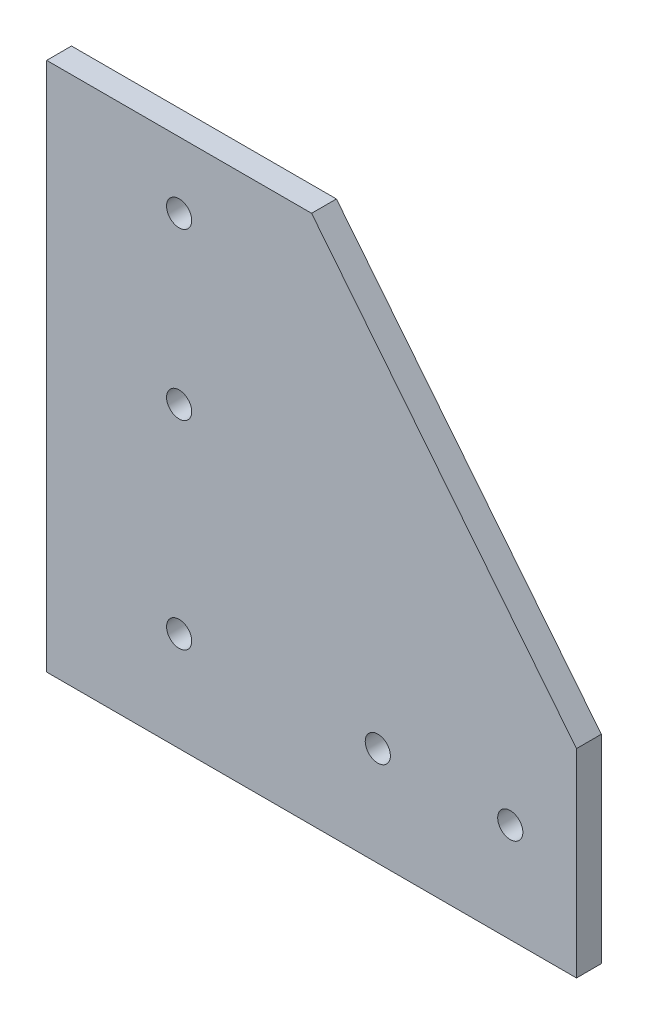
ISO-10303-21;
HEADER;
FILE_DESCRIPTION(('STEP AP214'),'2;1');
FILE_NAME('part.step','',(''),(''),'','','');
FILE_SCHEMA(('AUTOMOTIVE_DESIGN { 1 0 10303 214 1 1 1 1 }'));
ENDSEC;
DATA;
#1=APPLICATION_CONTEXT('core data for automotive mechanical design processes');
#2=APPLICATION_PROTOCOL_DEFINITION('international standard','automotive_design',2000,#1);
#3=PRODUCT_CONTEXT('',#1,'mechanical');
#4=PRODUCT('Part','Part','',(#3));
#5=PRODUCT_RELATED_PRODUCT_CATEGORY('part','',(#4));
#6=PRODUCT_DEFINITION_FORMATION('','',#4);
#7=PRODUCT_DEFINITION_CONTEXT('part definition',#1,'design');
#8=PRODUCT_DEFINITION('design','',#6,#7);
#9=PRODUCT_DEFINITION_SHAPE('','',#8);
#10=(LENGTH_UNIT() NAMED_UNIT(*) SI_UNIT(.MILLI.,.METRE.));
#11=(NAMED_UNIT(*) PLANE_ANGLE_UNIT() SI_UNIT($,.RADIAN.));
#12=(NAMED_UNIT(*) SI_UNIT($,.STERADIAN.) SOLID_ANGLE_UNIT());
#13=UNCERTAINTY_MEASURE_WITH_UNIT(LENGTH_MEASURE(1.E-05),#10,'distance_accuracy_value','');
#14=(GEOMETRIC_REPRESENTATION_CONTEXT(3) GLOBAL_UNCERTAINTY_ASSIGNED_CONTEXT((#13)) GLOBAL_UNIT_ASSIGNED_CONTEXT((#10,
#11,#12)) REPRESENTATION_CONTEXT('',''));
#15=CARTESIAN_POINT('',(0.,0.,0.));
#16=DIRECTION('',(0.,0.,1.));
#17=DIRECTION('',(1.,0.,0.));
#18=AXIS2_PLACEMENT_3D('',#15,#16,#17);
#19=CARTESIAN_POINT('',(0.,0.,4.7625));
#20=DIRECTION('',(0.,1.,0.));
#21=DIRECTION('',(0.,0.,1.));
#22=AXIS2_PLACEMENT_3D('',#19,#20,#21);
#23=PLANE('',#22);
#24=DIRECTION('',(1.,0.,0.));
#25=VECTOR('',#24,1.);
#26=CARTESIAN_POINT('',(0.,0.,0.));
#27=LINE('',#26,#25);
#28=CARTESIAN_POINT('',(0.,0.,0.));
#29=VERTEX_POINT('',#28);
#30=CARTESIAN_POINT('',(101.6,0.,0.));
#31=VERTEX_POINT('',#30);
#32=EDGE_CURVE('E129',#29,#31,#27,.T.);
#33=ORIENTED_EDGE('',*,*,#32,.T.);
#34=DIRECTION('',(0.,0.,-1.));
#35=VECTOR('',#34,1.);
#36=CARTESIAN_POINT('',(101.6,0.,4.7625));
#37=LINE('',#36,#35);
#38=CARTESIAN_POINT('',(101.6,0.,4.7625));
#39=VERTEX_POINT('',#38);
#40=EDGE_CURVE('E11',#39,#31,#37,.T.);
#41=ORIENTED_EDGE('',*,*,#40,.F.);
#42=DIRECTION('',(1.,0.,0.));
#43=VECTOR('',#42,1.);
#44=CARTESIAN_POINT('',(0.,0.,4.7625));
#45=LINE('',#44,#43);
#46=CARTESIAN_POINT('',(0.,0.,4.7625));
#47=VERTEX_POINT('',#46);
#48=EDGE_CURVE('E307',#47,#39,#45,.T.);
#49=ORIENTED_EDGE('',*,*,#48,.F.);
#50=DIRECTION('',(0.,0.,-1.));
#51=VECTOR('',#50,1.);
#52=CARTESIAN_POINT('',(0.,0.,4.7625));
#53=LINE('',#52,#51);
#54=EDGE_CURVE('E56',#47,#29,#53,.T.);
#55=ORIENTED_EDGE('',*,*,#54,.T.);
#56=EDGE_LOOP('',(#33,#41,#49,#55));
#57=FACE_BOUND('',#56,.T.);
#58=ADVANCED_FACE('F39',(#57),#23,.F.);
#59=CARTESIAN_POINT('',(101.6,0.,4.7625));
#60=DIRECTION('',(-1.,0.,0.));
#61=DIRECTION('',(0.,0.,1.));
#62=AXIS2_PLACEMENT_3D('',#59,#60,#61);
#63=PLANE('',#62);
#64=DIRECTION('',(0.,1.,0.));
#65=VECTOR('',#64,1.);
#66=CARTESIAN_POINT('',(101.6,0.,0.));
#67=LINE('',#66,#65);
#68=CARTESIAN_POINT('',(101.6,38.1,0.));
#69=VERTEX_POINT('',#68);
#70=EDGE_CURVE('E131',#31,#69,#67,.T.);
#71=ORIENTED_EDGE('',*,*,#70,.T.);
#72=DIRECTION('',(0.,0.,-1.));
#73=VECTOR('',#72,1.);
#74=CARTESIAN_POINT('',(101.6,38.1,4.7625));
#75=LINE('',#74,#73);
#76=CARTESIAN_POINT('',(101.6,38.1,4.7625));
#77=VERTEX_POINT('',#76);
#78=EDGE_CURVE('E48',#77,#69,#75,.T.);
#79=ORIENTED_EDGE('',*,*,#78,.F.);
#80=DIRECTION('',(0.,1.,0.));
#81=VECTOR('',#80,1.);
#82=CARTESIAN_POINT('',(101.6,0.,4.7625));
#83=LINE('',#82,#81);
#84=EDGE_CURVE('E85',#39,#77,#83,.T.);
#85=ORIENTED_EDGE('',*,*,#84,.F.);
#86=ORIENTED_EDGE('',*,*,#40,.T.);
#87=EDGE_LOOP('',(#71,#79,#85,#86));
#88=FACE_BOUND('',#87,.T.);
#89=ADVANCED_FACE('F142',(#88),#63,.F.);
#90=CARTESIAN_POINT('',(80.5365853658537,64.4292682926829,4.7625));
#91=DIRECTION('',(0.78086880944303,0.624695047554424,0.));
#92=DIRECTION('',(-0.624695047554424,0.78086880944303,0.));
#93=AXIS2_PLACEMENT_3D('',#90,#91,#92);
#94=PLANE('',#93);
#95=DIRECTION('',(0.624695047554424,-0.78086880944303,0.));
#96=VECTOR('',#95,1.);
#97=CARTESIAN_POINT('',(80.5365853658537,64.4292682926829,0.));
#98=LINE('',#97,#96);
#99=CARTESIAN_POINT('',(50.8,101.6,0.));
#100=VERTEX_POINT('',#99);
#101=EDGE_CURVE('E97',#100,#69,#98,.T.);
#102=ORIENTED_EDGE('',*,*,#101,.F.);
#103=DIRECTION('',(0.,0.,-1.));
#104=VECTOR('',#103,1.);
#105=CARTESIAN_POINT('',(50.8,101.6,4.7625));
#106=LINE('',#105,#104);
#107=CARTESIAN_POINT('',(50.8,101.6,4.7625));
#108=VERTEX_POINT('',#107);
#109=EDGE_CURVE('E92',#108,#100,#106,.T.);
#110=ORIENTED_EDGE('',*,*,#109,.F.);
#111=DIRECTION('',(0.624695047554424,-0.78086880944303,0.));
#112=VECTOR('',#111,1.);
#113=CARTESIAN_POINT('',(80.5365853658537,64.4292682926829,4.7625));
#114=LINE('',#113,#112);
#115=EDGE_CURVE('E95',#108,#77,#114,.T.);
#116=ORIENTED_EDGE('',*,*,#115,.T.);
#117=ORIENTED_EDGE('',*,*,#78,.T.);
#118=EDGE_LOOP('',(#102,#110,#116,#117));
#119=FACE_BOUND('',#118,.T.);
#120=ADVANCED_FACE('F94',(#119),#94,.T.);
#121=CARTESIAN_POINT('',(0.,101.6,4.7625));
#122=DIRECTION('',(0.,1.,0.));
#123=DIRECTION('',(0.,0.,1.));
#124=AXIS2_PLACEMENT_3D('',#121,#122,#123);
#125=PLANE('',#124);
#126=DIRECTION('',(1.,0.,0.));
#127=VECTOR('',#126,1.);
#128=CARTESIAN_POINT('',(0.,101.6,0.));
#129=LINE('',#128,#127);
#130=CARTESIAN_POINT('',(0.,101.6,0.));
#131=VERTEX_POINT('',#130);
#132=EDGE_CURVE('E135',#131,#100,#129,.T.);
#133=ORIENTED_EDGE('',*,*,#132,.F.);
#134=DIRECTION('',(0.,0.,-1.));
#135=VECTOR('',#134,1.);
#136=CARTESIAN_POINT('',(0.,101.6,4.7625));
#137=LINE('',#136,#135);
#138=CARTESIAN_POINT('',(0.,101.6,4.7625));
#139=VERTEX_POINT('',#138);
#140=EDGE_CURVE('E73',#139,#131,#137,.T.);
#141=ORIENTED_EDGE('',*,*,#140,.F.);
#142=DIRECTION('',(1.,0.,0.));
#143=VECTOR('',#142,1.);
#144=CARTESIAN_POINT('',(0.,101.6,4.7625));
#145=LINE('',#144,#143);
#146=EDGE_CURVE('E106',#139,#108,#145,.T.);
#147=ORIENTED_EDGE('',*,*,#146,.T.);
#148=ORIENTED_EDGE('',*,*,#109,.T.);
#149=EDGE_LOOP('',(#133,#141,#147,#148));
#150=FACE_BOUND('',#149,.T.);
#151=ADVANCED_FACE('F108',(#150),#125,.T.);
#152=CARTESIAN_POINT('',(25.4,19.05,4.7625));
#153=DIRECTION('',(0.,0.,-1.));
#154=DIRECTION('',(-1.,0.,0.));
#155=AXIS2_PLACEMENT_3D('',#152,#153,#154);
#156=CYLINDRICAL_SURFACE('',#155,2.413);
#157=CARTESIAN_POINT('',(25.4,19.05,4.7625));
#158=DIRECTION('',(0.,0.,1.));
#159=DIRECTION('',(1.,0.,0.));
#160=AXIS2_PLACEMENT_3D('',#157,#158,#159);
#161=CIRCLE('',#160,2.413);
#162=CARTESIAN_POINT('',(22.987,19.05,4.7625));
#163=VERTEX_POINT('',#162);
#164=EDGE_CURVE('E304',#163,#163,#161,.T.);
#165=CARTESIAN_POINT('',(25.4,19.05,0.));
#166=DIRECTION('',(0.,0.,1.));
#167=DIRECTION('',(1.,0.,0.));
#168=AXIS2_PLACEMENT_3D('',#165,#166,#167);
#169=CIRCLE('',#168,2.413);
#170=CARTESIAN_POINT('',(22.987,19.05,0.));
#171=VERTEX_POINT('',#170);
#172=EDGE_CURVE('E126',#171,#171,#169,.T.);
#173=CARTESIAN_POINT('',(22.987,19.05,4.7625));
#174=CARTESIAN_POINT('',(22.987,19.05,4.712890625));
#175=CARTESIAN_POINT('',(22.987,19.05,4.66328125));
#176=CARTESIAN_POINT('',(22.987,19.05,4.5640625));
#177=CARTESIAN_POINT('',(22.987,19.05,4.514453125));
#178=CARTESIAN_POINT('',(22.987,19.05,4.415234375));
#179=CARTESIAN_POINT('',(22.987,19.05,4.365625));
#180=CARTESIAN_POINT('',(22.987,19.05,4.26640625));
#181=CARTESIAN_POINT('',(22.987,19.05,4.216796875));
#182=CARTESIAN_POINT('',(22.987,19.05,4.117578125));
#183=CARTESIAN_POINT('',(22.987,19.05,4.06796875));
#184=CARTESIAN_POINT('',(22.987,19.05,3.96875));
#185=CARTESIAN_POINT('',(22.987,19.05,3.919140625));
#186=CARTESIAN_POINT('',(22.987,19.05,3.819921875));
#187=CARTESIAN_POINT('',(22.987,19.05,3.7703125));
#188=CARTESIAN_POINT('',(22.987,19.05,3.67109375));
#189=CARTESIAN_POINT('',(22.987,19.05,3.621484375));
#190=CARTESIAN_POINT('',(22.987,19.05,3.522265625));
#191=CARTESIAN_POINT('',(22.987,19.05,3.47265625));
#192=CARTESIAN_POINT('',(22.987,19.05,3.3734375));
#193=CARTESIAN_POINT('',(22.987,19.05,3.323828125));
#194=CARTESIAN_POINT('',(22.987,19.05,3.224609375));
#195=CARTESIAN_POINT('',(22.987,19.05,3.175));
#196=CARTESIAN_POINT('',(22.987,19.05,3.07578125));
#197=CARTESIAN_POINT('',(22.987,19.05,3.026171875));
#198=CARTESIAN_POINT('',(22.987,19.05,2.926953125));
#199=CARTESIAN_POINT('',(22.987,19.05,2.87734375));
#200=CARTESIAN_POINT('',(22.987,19.05,2.778125));
#201=CARTESIAN_POINT('',(22.987,19.05,2.728515625));
#202=CARTESIAN_POINT('',(22.987,19.05,2.629296875));
#203=CARTESIAN_POINT('',(22.987,19.05,2.5796875));
#204=CARTESIAN_POINT('',(22.987,19.05,2.48046875));
#205=CARTESIAN_POINT('',(22.987,19.05,2.430859375));
#206=CARTESIAN_POINT('',(22.987,19.05,2.331640625));
#207=CARTESIAN_POINT('',(22.987,19.05,2.28203125));
#208=CARTESIAN_POINT('',(22.987,19.05,2.1828125));
#209=CARTESIAN_POINT('',(22.987,19.05,2.133203125));
#210=CARTESIAN_POINT('',(22.987,19.05,2.033984375));
#211=CARTESIAN_POINT('',(22.987,19.05,1.984375));
#212=CARTESIAN_POINT('',(22.987,19.05,1.88515625));
#213=CARTESIAN_POINT('',(22.987,19.05,1.835546875));
#214=CARTESIAN_POINT('',(22.987,19.05,1.736328125));
#215=CARTESIAN_POINT('',(22.987,19.05,1.68671875));
#216=CARTESIAN_POINT('',(22.987,19.05,1.5875));
#217=CARTESIAN_POINT('',(22.987,19.05,1.537890625));
#218=CARTESIAN_POINT('',(22.987,19.05,1.438671875));
#219=CARTESIAN_POINT('',(22.987,19.05,1.3890625));
#220=CARTESIAN_POINT('',(22.987,19.05,1.28984375));
#221=CARTESIAN_POINT('',(22.987,19.05,1.240234375));
#222=CARTESIAN_POINT('',(22.987,19.05,1.141015625));
#223=CARTESIAN_POINT('',(22.987,19.05,1.09140625));
#224=CARTESIAN_POINT('',(22.987,19.05,0.992187499999999));
#225=CARTESIAN_POINT('',(22.987,19.05,0.942578124999999));
#226=CARTESIAN_POINT('',(22.987,19.05,0.843359375));
#227=CARTESIAN_POINT('',(22.987,19.05,0.79375));
#228=CARTESIAN_POINT('',(22.987,19.05,0.69453125));
#229=CARTESIAN_POINT('',(22.987,19.05,0.644921875));
#230=CARTESIAN_POINT('',(22.987,19.05,0.545703125));
#231=CARTESIAN_POINT('',(22.987,19.05,0.49609375));
#232=CARTESIAN_POINT('',(22.987,19.05,0.396875));
#233=CARTESIAN_POINT('',(22.987,19.05,0.347265625));
#234=CARTESIAN_POINT('',(22.987,19.05,0.248046875));
#235=CARTESIAN_POINT('',(22.987,19.05,0.1984375));
#236=CARTESIAN_POINT('',(22.987,19.05,0.09921875));
#237=CARTESIAN_POINT('',(22.987,19.05,0.049609375));
#238=CARTESIAN_POINT('',(22.987,19.05,0.));
#239=B_SPLINE_CURVE_WITH_KNOTS('',3,(#173,#174,#175,#176,#177,#178,#179,#180,#181,#182,#183,
#184,#185,#186,#187,#188,#189,#190,#191,#192,#193,#194,#195,#196,#197,#198,#199,#200,#201,#202,
#203,#204,#205,#206,#207,#208,#209,#210,#211,#212,#213,#214,#215,#216,#217,#218,#219,#220,#221,
#222,#223,#224,#225,#226,#227,#228,#229,#230,#231,#232,#233,#234,#235,#236,#237,#238),
.UNSPECIFIED.,.F.,.F.,(4,2,2,2,2,2,2,2,2,2,2,2,2,2,2,2,2,2,2,2,2,2,2,2,2,2,2,2,2,2,2,2,4),(0.,
0.148828125,0.29765625,0.446484375,0.5953125,0.744140625,0.892968750000001,1.041796875,1.190625,
1.339453125,1.48828125,1.637109375,1.7859375,1.934765625,2.08359375,2.232421875,2.38125,
2.530078125,2.67890625,2.827734375,2.9765625,3.125390625,3.27421875,3.423046875,3.571875,
3.720703125,3.86953125,4.018359375,4.1671875,4.316015625,4.46484375,4.613671875,4.7625),.UNSPECIFIED.);
#240=EDGE_CURVE('BSEAM167',#163,#171,#239,.T.);
#241=ORIENTED_EDGE('',*,*,#164,.T.);
#242=ORIENTED_EDGE('',*,*,#172,.F.);
#243=ORIENTED_EDGE('',*,*,#240,.T.);
#244=ORIENTED_EDGE('',*,*,#240,.F.);
#245=EDGE_LOOP('',(#241,#243,#242,#244));
#246=FACE_BOUND('',#245,.T.);
#247=ADVANCED_FACE('F167',(#246),#156,.F.);
#248=CARTESIAN_POINT('',(25.4,57.15,4.7625));
#249=DIRECTION('',(0.,0.,-1.));
#250=DIRECTION('',(-1.,0.,0.));
#251=AXIS2_PLACEMENT_3D('',#248,#249,#250);
#252=CYLINDRICAL_SURFACE('',#251,2.413);
#253=CARTESIAN_POINT('',(25.4,57.15,4.7625));
#254=DIRECTION('',(0.,0.,1.));
#255=DIRECTION('',(1.,0.,0.));
#256=AXIS2_PLACEMENT_3D('',#253,#254,#255);
#257=CIRCLE('',#256,2.413);
#258=CARTESIAN_POINT('',(22.987,57.15,4.7625));
#259=VERTEX_POINT('',#258);
#260=EDGE_CURVE('E297',#259,#259,#257,.T.);
#261=CARTESIAN_POINT('',(25.4,57.15,0.));
#262=DIRECTION('',(0.,0.,1.));
#263=DIRECTION('',(1.,0.,0.));
#264=AXIS2_PLACEMENT_3D('',#261,#262,#263);
#265=CIRCLE('',#264,2.413);
#266=CARTESIAN_POINT('',(22.987,57.15,0.));
#267=VERTEX_POINT('',#266);
#268=EDGE_CURVE('E123',#267,#267,#265,.T.);
#269=CARTESIAN_POINT('',(22.987,57.15,4.7625));
#270=CARTESIAN_POINT('',(22.987,57.15,4.712890625));
#271=CARTESIAN_POINT('',(22.987,57.15,4.66328125));
#272=CARTESIAN_POINT('',(22.987,57.15,4.5640625));
#273=CARTESIAN_POINT('',(22.987,57.15,4.514453125));
#274=CARTESIAN_POINT('',(22.987,57.15,4.415234375));
#275=CARTESIAN_POINT('',(22.987,57.15,4.365625));
#276=CARTESIAN_POINT('',(22.987,57.15,4.26640625));
#277=CARTESIAN_POINT('',(22.987,57.15,4.216796875));
#278=CARTESIAN_POINT('',(22.987,57.15,4.117578125));
#279=CARTESIAN_POINT('',(22.987,57.15,4.06796875));
#280=CARTESIAN_POINT('',(22.987,57.15,3.96875));
#281=CARTESIAN_POINT('',(22.987,57.15,3.919140625));
#282=CARTESIAN_POINT('',(22.987,57.15,3.819921875));
#283=CARTESIAN_POINT('',(22.987,57.15,3.7703125));
#284=CARTESIAN_POINT('',(22.987,57.15,3.67109375));
#285=CARTESIAN_POINT('',(22.987,57.15,3.621484375));
#286=CARTESIAN_POINT('',(22.987,57.15,3.522265625));
#287=CARTESIAN_POINT('',(22.987,57.15,3.47265625));
#288=CARTESIAN_POINT('',(22.987,57.15,3.3734375));
#289=CARTESIAN_POINT('',(22.987,57.15,3.323828125));
#290=CARTESIAN_POINT('',(22.987,57.15,3.224609375));
#291=CARTESIAN_POINT('',(22.987,57.15,3.175));
#292=CARTESIAN_POINT('',(22.987,57.15,3.07578125));
#293=CARTESIAN_POINT('',(22.987,57.15,3.026171875));
#294=CARTESIAN_POINT('',(22.987,57.15,2.926953125));
#295=CARTESIAN_POINT('',(22.987,57.15,2.87734375));
#296=CARTESIAN_POINT('',(22.987,57.15,2.778125));
#297=CARTESIAN_POINT('',(22.987,57.15,2.728515625));
#298=CARTESIAN_POINT('',(22.987,57.15,2.629296875));
#299=CARTESIAN_POINT('',(22.987,57.15,2.5796875));
#300=CARTESIAN_POINT('',(22.987,57.15,2.48046875));
#301=CARTESIAN_POINT('',(22.987,57.15,2.430859375));
#302=CARTESIAN_POINT('',(22.987,57.15,2.331640625));
#303=CARTESIAN_POINT('',(22.987,57.15,2.28203125));
#304=CARTESIAN_POINT('',(22.987,57.15,2.1828125));
#305=CARTESIAN_POINT('',(22.987,57.15,2.133203125));
#306=CARTESIAN_POINT('',(22.987,57.15,2.033984375));
#307=CARTESIAN_POINT('',(22.987,57.15,1.984375));
#308=CARTESIAN_POINT('',(22.987,57.15,1.88515625));
#309=CARTESIAN_POINT('',(22.987,57.15,1.835546875));
#310=CARTESIAN_POINT('',(22.987,57.15,1.736328125));
#311=CARTESIAN_POINT('',(22.987,57.15,1.68671875));
#312=CARTESIAN_POINT('',(22.987,57.15,1.5875));
#313=CARTESIAN_POINT('',(22.987,57.15,1.537890625));
#314=CARTESIAN_POINT('',(22.987,57.15,1.438671875));
#315=CARTESIAN_POINT('',(22.987,57.15,1.3890625));
#316=CARTESIAN_POINT('',(22.987,57.15,1.28984375));
#317=CARTESIAN_POINT('',(22.987,57.15,1.240234375));
#318=CARTESIAN_POINT('',(22.987,57.15,1.141015625));
#319=CARTESIAN_POINT('',(22.987,57.15,1.09140625));
#320=CARTESIAN_POINT('',(22.987,57.15,0.992187499999999));
#321=CARTESIAN_POINT('',(22.987,57.15,0.942578124999999));
#322=CARTESIAN_POINT('',(22.987,57.15,0.843359375));
#323=CARTESIAN_POINT('',(22.987,57.15,0.79375));
#324=CARTESIAN_POINT('',(22.987,57.15,0.69453125));
#325=CARTESIAN_POINT('',(22.987,57.15,0.644921875));
#326=CARTESIAN_POINT('',(22.987,57.15,0.545703125));
#327=CARTESIAN_POINT('',(22.987,57.15,0.49609375));
#328=CARTESIAN_POINT('',(22.987,57.15,0.396875));
#329=CARTESIAN_POINT('',(22.987,57.15,0.347265625));
#330=CARTESIAN_POINT('',(22.987,57.15,0.248046875));
#331=CARTESIAN_POINT('',(22.987,57.15,0.1984375));
#332=CARTESIAN_POINT('',(22.987,57.15,0.09921875));
#333=CARTESIAN_POINT('',(22.987,57.15,0.049609375));
#334=CARTESIAN_POINT('',(22.987,57.15,0.));
#335=B_SPLINE_CURVE_WITH_KNOTS('',3,(#269,#270,#271,#272,#273,#274,#275,#276,#277,#278,#279,
#280,#281,#282,#283,#284,#285,#286,#287,#288,#289,#290,#291,#292,#293,#294,#295,#296,#297,#298,
#299,#300,#301,#302,#303,#304,#305,#306,#307,#308,#309,#310,#311,#312,#313,#314,#315,#316,#317,
#318,#319,#320,#321,#322,#323,#324,#325,#326,#327,#328,#329,#330,#331,#332,#333,#334),
.UNSPECIFIED.,.F.,.F.,(4,2,2,2,2,2,2,2,2,2,2,2,2,2,2,2,2,2,2,2,2,2,2,2,2,2,2,2,2,2,2,2,4),(0.,
0.148828125,0.29765625,0.446484375,0.5953125,0.744140625,0.892968750000001,1.041796875,1.190625,
1.339453125,1.48828125,1.637109375,1.7859375,1.934765625,2.08359375,2.232421875,2.38125,
2.530078125,2.67890625,2.827734375,2.9765625,3.125390625,3.27421875,3.423046875,3.571875,
3.720703125,3.86953125,4.018359375,4.1671875,4.316015625,4.46484375,4.613671875,4.7625),.UNSPECIFIED.);
#336=EDGE_CURVE('BSEAM170',#259,#267,#335,.T.);
#337=ORIENTED_EDGE('',*,*,#260,.T.);
#338=ORIENTED_EDGE('',*,*,#268,.F.);
#339=ORIENTED_EDGE('',*,*,#336,.T.);
#340=ORIENTED_EDGE('',*,*,#336,.F.);
#341=EDGE_LOOP('',(#337,#339,#338,#340));
#342=FACE_BOUND('',#341,.T.);
#343=ADVANCED_FACE('F170',(#342),#252,.F.);
#344=CARTESIAN_POINT('',(25.4,88.9,4.7625));
#345=DIRECTION('',(0.,0.,-1.));
#346=DIRECTION('',(-1.,0.,0.));
#347=AXIS2_PLACEMENT_3D('',#344,#345,#346);
#348=CYLINDRICAL_SURFACE('',#347,2.413);
#349=CARTESIAN_POINT('',(25.4,88.9,4.7625));
#350=DIRECTION('',(0.,0.,1.));
#351=DIRECTION('',(1.,0.,0.));
#352=AXIS2_PLACEMENT_3D('',#349,#350,#351);
#353=CIRCLE('',#352,2.413);
#354=CARTESIAN_POINT('',(22.987,88.9,4.7625));
#355=VERTEX_POINT('',#354);
#356=EDGE_CURVE('E294',#355,#355,#353,.T.);
#357=CARTESIAN_POINT('',(25.4,88.9,0.));
#358=DIRECTION('',(0.,0.,1.));
#359=DIRECTION('',(1.,0.,0.));
#360=AXIS2_PLACEMENT_3D('',#357,#358,#359);
#361=CIRCLE('',#360,2.413);
#362=CARTESIAN_POINT('',(22.987,88.9,0.));
#363=VERTEX_POINT('',#362);
#364=EDGE_CURVE('E120',#363,#363,#361,.T.);
#365=CARTESIAN_POINT('',(22.987,88.9,4.7625));
#366=CARTESIAN_POINT('',(22.987,88.9,4.712890625));
#367=CARTESIAN_POINT('',(22.987,88.9,4.66328125));
#368=CARTESIAN_POINT('',(22.987,88.9,4.5640625));
#369=CARTESIAN_POINT('',(22.987,88.9,4.514453125));
#370=CARTESIAN_POINT('',(22.987,88.9,4.415234375));
#371=CARTESIAN_POINT('',(22.987,88.9,4.365625));
#372=CARTESIAN_POINT('',(22.987,88.9,4.26640625));
#373=CARTESIAN_POINT('',(22.987,88.9,4.216796875));
#374=CARTESIAN_POINT('',(22.987,88.9,4.117578125));
#375=CARTESIAN_POINT('',(22.987,88.9,4.06796875));
#376=CARTESIAN_POINT('',(22.987,88.9,3.96875));
#377=CARTESIAN_POINT('',(22.987,88.9,3.919140625));
#378=CARTESIAN_POINT('',(22.987,88.9,3.819921875));
#379=CARTESIAN_POINT('',(22.987,88.9,3.7703125));
#380=CARTESIAN_POINT('',(22.987,88.9,3.67109375));
#381=CARTESIAN_POINT('',(22.987,88.9,3.621484375));
#382=CARTESIAN_POINT('',(22.987,88.9,3.522265625));
#383=CARTESIAN_POINT('',(22.987,88.9,3.47265625));
#384=CARTESIAN_POINT('',(22.987,88.9,3.3734375));
#385=CARTESIAN_POINT('',(22.987,88.9,3.323828125));
#386=CARTESIAN_POINT('',(22.987,88.9,3.224609375));
#387=CARTESIAN_POINT('',(22.987,88.9,3.175));
#388=CARTESIAN_POINT('',(22.987,88.9,3.07578125));
#389=CARTESIAN_POINT('',(22.987,88.9,3.026171875));
#390=CARTESIAN_POINT('',(22.987,88.9,2.926953125));
#391=CARTESIAN_POINT('',(22.987,88.9,2.87734375));
#392=CARTESIAN_POINT('',(22.987,88.9,2.778125));
#393=CARTESIAN_POINT('',(22.987,88.9,2.728515625));
#394=CARTESIAN_POINT('',(22.987,88.9,2.629296875));
#395=CARTESIAN_POINT('',(22.987,88.9,2.5796875));
#396=CARTESIAN_POINT('',(22.987,88.9,2.48046875));
#397=CARTESIAN_POINT('',(22.987,88.9,2.430859375));
#398=CARTESIAN_POINT('',(22.987,88.9,2.331640625));
#399=CARTESIAN_POINT('',(22.987,88.9,2.28203125));
#400=CARTESIAN_POINT('',(22.987,88.9,2.1828125));
#401=CARTESIAN_POINT('',(22.987,88.9,2.133203125));
#402=CARTESIAN_POINT('',(22.987,88.9,2.033984375));
#403=CARTESIAN_POINT('',(22.987,88.9,1.984375));
#404=CARTESIAN_POINT('',(22.987,88.9,1.88515625));
#405=CARTESIAN_POINT('',(22.987,88.9,1.835546875));
#406=CARTESIAN_POINT('',(22.987,88.9,1.736328125));
#407=CARTESIAN_POINT('',(22.987,88.9,1.68671875));
#408=CARTESIAN_POINT('',(22.987,88.9,1.5875));
#409=CARTESIAN_POINT('',(22.987,88.9,1.537890625));
#410=CARTESIAN_POINT('',(22.987,88.9,1.438671875));
#411=CARTESIAN_POINT('',(22.987,88.9,1.3890625));
#412=CARTESIAN_POINT('',(22.987,88.9,1.28984375));
#413=CARTESIAN_POINT('',(22.987,88.9,1.240234375));
#414=CARTESIAN_POINT('',(22.987,88.9,1.141015625));
#415=CARTESIAN_POINT('',(22.987,88.9,1.09140625));
#416=CARTESIAN_POINT('',(22.987,88.9,0.992187499999999));
#417=CARTESIAN_POINT('',(22.987,88.9,0.942578124999999));
#418=CARTESIAN_POINT('',(22.987,88.9,0.843359375));
#419=CARTESIAN_POINT('',(22.987,88.9,0.79375));
#420=CARTESIAN_POINT('',(22.987,88.9,0.69453125));
#421=CARTESIAN_POINT('',(22.987,88.9,0.644921875));
#422=CARTESIAN_POINT('',(22.987,88.9,0.545703125));
#423=CARTESIAN_POINT('',(22.987,88.9,0.49609375));
#424=CARTESIAN_POINT('',(22.987,88.9,0.396875));
#425=CARTESIAN_POINT('',(22.987,88.9,0.347265625));
#426=CARTESIAN_POINT('',(22.987,88.9,0.248046875));
#427=CARTESIAN_POINT('',(22.987,88.9,0.1984375));
#428=CARTESIAN_POINT('',(22.987,88.9,0.09921875));
#429=CARTESIAN_POINT('',(22.987,88.9,0.049609375));
#430=CARTESIAN_POINT('',(22.987,88.9,0.));
#431=B_SPLINE_CURVE_WITH_KNOTS('',3,(#365,#366,#367,#368,#369,#370,#371,#372,#373,#374,#375,
#376,#377,#378,#379,#380,#381,#382,#383,#384,#385,#386,#387,#388,#389,#390,#391,#392,#393,#394,
#395,#396,#397,#398,#399,#400,#401,#402,#403,#404,#405,#406,#407,#408,#409,#410,#411,#412,#413,
#414,#415,#416,#417,#418,#419,#420,#421,#422,#423,#424,#425,#426,#427,#428,#429,#430),
.UNSPECIFIED.,.F.,.F.,(4,2,2,2,2,2,2,2,2,2,2,2,2,2,2,2,2,2,2,2,2,2,2,2,2,2,2,2,2,2,2,2,4),(0.,
0.148828125,0.29765625,0.446484375,0.5953125,0.744140625,0.892968750000001,1.041796875,1.190625,
1.339453125,1.48828125,1.637109375,1.7859375,1.934765625,2.08359375,2.232421875,2.38125,
2.530078125,2.67890625,2.827734375,2.9765625,3.125390625,3.27421875,3.423046875,3.571875,
3.720703125,3.86953125,4.018359375,4.1671875,4.316015625,4.46484375,4.613671875,4.7625),.UNSPECIFIED.);
#432=EDGE_CURVE('BSEAM174',#355,#363,#431,.T.);
#433=ORIENTED_EDGE('',*,*,#356,.T.);
#434=ORIENTED_EDGE('',*,*,#364,.F.);
#435=ORIENTED_EDGE('',*,*,#432,.T.);
#436=ORIENTED_EDGE('',*,*,#432,.F.);
#437=EDGE_LOOP('',(#433,#435,#434,#436));
#438=FACE_BOUND('',#437,.T.);
#439=ADVANCED_FACE('F174',(#438),#348,.F.);
#440=CARTESIAN_POINT('',(88.9,19.05,4.7625));
#441=DIRECTION('',(0.,0.,-1.));
#442=DIRECTION('',(-1.,0.,0.));
#443=AXIS2_PLACEMENT_3D('',#440,#441,#442);
#444=CYLINDRICAL_SURFACE('',#443,2.413);
#445=CARTESIAN_POINT('',(88.9,19.05,4.7625));
#446=DIRECTION('',(0.,0.,1.));
#447=DIRECTION('',(1.,0.,0.));
#448=AXIS2_PLACEMENT_3D('',#445,#446,#447);
#449=CIRCLE('',#448,2.413);
#450=CARTESIAN_POINT('',(86.487,19.05,4.7625));
#451=VERTEX_POINT('',#450);
#452=EDGE_CURVE('E185',#451,#451,#449,.T.);
#453=CARTESIAN_POINT('',(88.9,19.05,0.));
#454=DIRECTION('',(0.,0.,1.));
#455=DIRECTION('',(1.,0.,0.));
#456=AXIS2_PLACEMENT_3D('',#453,#454,#455);
#457=CIRCLE('',#456,2.413);
#458=CARTESIAN_POINT('',(86.487,19.05,0.));
#459=VERTEX_POINT('',#458);
#460=EDGE_CURVE('E117',#459,#459,#457,.T.);
#461=CARTESIAN_POINT('',(86.487,19.05,4.7625));
#462=CARTESIAN_POINT('',(86.487,19.05,4.712890625));
#463=CARTESIAN_POINT('',(86.487,19.05,4.66328125));
#464=CARTESIAN_POINT('',(86.487,19.05,4.5640625));
#465=CARTESIAN_POINT('',(86.487,19.05,4.514453125));
#466=CARTESIAN_POINT('',(86.487,19.05,4.415234375));
#467=CARTESIAN_POINT('',(86.487,19.05,4.365625));
#468=CARTESIAN_POINT('',(86.487,19.05,4.26640625));
#469=CARTESIAN_POINT('',(86.487,19.05,4.216796875));
#470=CARTESIAN_POINT('',(86.487,19.05,4.117578125));
#471=CARTESIAN_POINT('',(86.487,19.05,4.06796875));
#472=CARTESIAN_POINT('',(86.487,19.05,3.96875));
#473=CARTESIAN_POINT('',(86.487,19.05,3.919140625));
#474=CARTESIAN_POINT('',(86.487,19.05,3.819921875));
#475=CARTESIAN_POINT('',(86.487,19.05,3.7703125));
#476=CARTESIAN_POINT('',(86.487,19.05,3.67109375));
#477=CARTESIAN_POINT('',(86.487,19.05,3.621484375));
#478=CARTESIAN_POINT('',(86.487,19.05,3.522265625));
#479=CARTESIAN_POINT('',(86.487,19.05,3.47265625));
#480=CARTESIAN_POINT('',(86.487,19.05,3.3734375));
#481=CARTESIAN_POINT('',(86.487,19.05,3.323828125));
#482=CARTESIAN_POINT('',(86.487,19.05,3.224609375));
#483=CARTESIAN_POINT('',(86.487,19.05,3.175));
#484=CARTESIAN_POINT('',(86.487,19.05,3.07578125));
#485=CARTESIAN_POINT('',(86.487,19.05,3.026171875));
#486=CARTESIAN_POINT('',(86.487,19.05,2.926953125));
#487=CARTESIAN_POINT('',(86.487,19.05,2.87734375));
#488=CARTESIAN_POINT('',(86.487,19.05,2.778125));
#489=CARTESIAN_POINT('',(86.487,19.05,2.728515625));
#490=CARTESIAN_POINT('',(86.487,19.05,2.629296875));
#491=CARTESIAN_POINT('',(86.487,19.05,2.5796875));
#492=CARTESIAN_POINT('',(86.487,19.05,2.48046875));
#493=CARTESIAN_POINT('',(86.487,19.05,2.430859375));
#494=CARTESIAN_POINT('',(86.487,19.05,2.331640625));
#495=CARTESIAN_POINT('',(86.487,19.05,2.28203125));
#496=CARTESIAN_POINT('',(86.487,19.05,2.1828125));
#497=CARTESIAN_POINT('',(86.487,19.05,2.133203125));
#498=CARTESIAN_POINT('',(86.487,19.05,2.033984375));
#499=CARTESIAN_POINT('',(86.487,19.05,1.984375));
#500=CARTESIAN_POINT('',(86.487,19.05,1.88515625));
#501=CARTESIAN_POINT('',(86.487,19.05,1.835546875));
#502=CARTESIAN_POINT('',(86.487,19.05,1.736328125));
#503=CARTESIAN_POINT('',(86.487,19.05,1.68671875));
#504=CARTESIAN_POINT('',(86.487,19.05,1.5875));
#505=CARTESIAN_POINT('',(86.487,19.05,1.537890625));
#506=CARTESIAN_POINT('',(86.487,19.05,1.438671875));
#507=CARTESIAN_POINT('',(86.487,19.05,1.3890625));
#508=CARTESIAN_POINT('',(86.487,19.05,1.28984375));
#509=CARTESIAN_POINT('',(86.487,19.05,1.240234375));
#510=CARTESIAN_POINT('',(86.487,19.05,1.141015625));
#511=CARTESIAN_POINT('',(86.487,19.05,1.09140625));
#512=CARTESIAN_POINT('',(86.487,19.05,0.992187499999999));
#513=CARTESIAN_POINT('',(86.487,19.05,0.942578124999999));
#514=CARTESIAN_POINT('',(86.487,19.05,0.843359375));
#515=CARTESIAN_POINT('',(86.487,19.05,0.79375));
#516=CARTESIAN_POINT('',(86.487,19.05,0.69453125));
#517=CARTESIAN_POINT('',(86.487,19.05,0.644921875));
#518=CARTESIAN_POINT('',(86.487,19.05,0.545703125));
#519=CARTESIAN_POINT('',(86.487,19.05,0.49609375));
#520=CARTESIAN_POINT('',(86.487,19.05,0.396875));
#521=CARTESIAN_POINT('',(86.487,19.05,0.347265625));
#522=CARTESIAN_POINT('',(86.487,19.05,0.248046875));
#523=CARTESIAN_POINT('',(86.487,19.05,0.1984375));
#524=CARTESIAN_POINT('',(86.487,19.05,0.09921875));
#525=CARTESIAN_POINT('',(86.487,19.05,0.049609375));
#526=CARTESIAN_POINT('',(86.487,19.05,0.));
#527=B_SPLINE_CURVE_WITH_KNOTS('',3,(#461,#462,#463,#464,#465,#466,#467,#468,#469,#470,#471,
#472,#473,#474,#475,#476,#477,#478,#479,#480,#481,#482,#483,#484,#485,#486,#487,#488,#489,#490,
#491,#492,#493,#494,#495,#496,#497,#498,#499,#500,#501,#502,#503,#504,#505,#506,#507,#508,#509,
#510,#511,#512,#513,#514,#515,#516,#517,#518,#519,#520,#521,#522,#523,#524,#525,#526),
.UNSPECIFIED.,.F.,.F.,(4,2,2,2,2,2,2,2,2,2,2,2,2,2,2,2,2,2,2,2,2,2,2,2,2,2,2,2,2,2,2,2,4),(0.,
0.148828125,0.29765625,0.446484375,0.5953125,0.744140625,0.892968750000001,1.041796875,1.190625,
1.339453125,1.48828125,1.637109375,1.7859375,1.934765625,2.08359375,2.232421875,2.38125,
2.530078125,2.67890625,2.827734375,2.9765625,3.125390625,3.27421875,3.423046875,3.571875,
3.720703125,3.86953125,4.018359375,4.1671875,4.316015625,4.46484375,4.613671875,4.7625),.UNSPECIFIED.);
#528=EDGE_CURVE('BSEAM155',#451,#459,#527,.T.);
#529=ORIENTED_EDGE('',*,*,#452,.T.);
#530=ORIENTED_EDGE('',*,*,#460,.F.);
#531=ORIENTED_EDGE('',*,*,#528,.T.);
#532=ORIENTED_EDGE('',*,*,#528,.F.);
#533=EDGE_LOOP('',(#529,#531,#530,#532));
#534=FACE_BOUND('',#533,.T.);
#535=ADVANCED_FACE('F155',(#534),#444,.F.);
#536=CARTESIAN_POINT('',(63.5,19.05,4.7625));
#537=DIRECTION('',(0.,0.,-1.));
#538=DIRECTION('',(-1.,0.,0.));
#539=AXIS2_PLACEMENT_3D('',#536,#537,#538);
#540=CYLINDRICAL_SURFACE('',#539,2.413);
#541=CARTESIAN_POINT('',(63.5,19.05,4.7625));
#542=DIRECTION('',(0.,0.,1.));
#543=DIRECTION('',(1.,0.,0.));
#544=AXIS2_PLACEMENT_3D('',#541,#542,#543);
#545=CIRCLE('',#544,2.413);
#546=CARTESIAN_POINT('',(61.087,19.05,4.7625));
#547=VERTEX_POINT('',#546);
#548=EDGE_CURVE('E140',#547,#547,#545,.T.);
#549=CARTESIAN_POINT('',(63.5,19.05,0.));
#550=DIRECTION('',(0.,0.,1.));
#551=DIRECTION('',(1.,0.,0.));
#552=AXIS2_PLACEMENT_3D('',#549,#550,#551);
#553=CIRCLE('',#552,2.413);
#554=CARTESIAN_POINT('',(61.087,19.05,0.));
#555=VERTEX_POINT('',#554);
#556=EDGE_CURVE('E114',#555,#555,#553,.T.);
#557=CARTESIAN_POINT('',(61.087,19.05,4.7625));
#558=CARTESIAN_POINT('',(61.087,19.05,4.712890625));
#559=CARTESIAN_POINT('',(61.087,19.05,4.66328125));
#560=CARTESIAN_POINT('',(61.087,19.05,4.5640625));
#561=CARTESIAN_POINT('',(61.087,19.05,4.514453125));
#562=CARTESIAN_POINT('',(61.087,19.05,4.415234375));
#563=CARTESIAN_POINT('',(61.087,19.05,4.365625));
#564=CARTESIAN_POINT('',(61.087,19.05,4.26640625));
#565=CARTESIAN_POINT('',(61.087,19.05,4.216796875));
#566=CARTESIAN_POINT('',(61.087,19.05,4.117578125));
#567=CARTESIAN_POINT('',(61.087,19.05,4.06796875));
#568=CARTESIAN_POINT('',(61.087,19.05,3.96875));
#569=CARTESIAN_POINT('',(61.087,19.05,3.919140625));
#570=CARTESIAN_POINT('',(61.087,19.05,3.819921875));
#571=CARTESIAN_POINT('',(61.087,19.05,3.7703125));
#572=CARTESIAN_POINT('',(61.087,19.05,3.67109375));
#573=CARTESIAN_POINT('',(61.087,19.05,3.621484375));
#574=CARTESIAN_POINT('',(61.087,19.05,3.522265625));
#575=CARTESIAN_POINT('',(61.087,19.05,3.47265625));
#576=CARTESIAN_POINT('',(61.087,19.05,3.3734375));
#577=CARTESIAN_POINT('',(61.087,19.05,3.323828125));
#578=CARTESIAN_POINT('',(61.087,19.05,3.224609375));
#579=CARTESIAN_POINT('',(61.087,19.05,3.175));
#580=CARTESIAN_POINT('',(61.087,19.05,3.07578125));
#581=CARTESIAN_POINT('',(61.087,19.05,3.026171875));
#582=CARTESIAN_POINT('',(61.087,19.05,2.926953125));
#583=CARTESIAN_POINT('',(61.087,19.05,2.87734375));
#584=CARTESIAN_POINT('',(61.087,19.05,2.778125));
#585=CARTESIAN_POINT('',(61.087,19.05,2.728515625));
#586=CARTESIAN_POINT('',(61.087,19.05,2.629296875));
#587=CARTESIAN_POINT('',(61.087,19.05,2.5796875));
#588=CARTESIAN_POINT('',(61.087,19.05,2.48046875));
#589=CARTESIAN_POINT('',(61.087,19.05,2.430859375));
#590=CARTESIAN_POINT('',(61.087,19.05,2.331640625));
#591=CARTESIAN_POINT('',(61.087,19.05,2.28203125));
#592=CARTESIAN_POINT('',(61.087,19.05,2.1828125));
#593=CARTESIAN_POINT('',(61.087,19.05,2.133203125));
#594=CARTESIAN_POINT('',(61.087,19.05,2.033984375));
#595=CARTESIAN_POINT('',(61.087,19.05,1.984375));
#596=CARTESIAN_POINT('',(61.087,19.05,1.88515625));
#597=CARTESIAN_POINT('',(61.087,19.05,1.835546875));
#598=CARTESIAN_POINT('',(61.087,19.05,1.736328125));
#599=CARTESIAN_POINT('',(61.087,19.05,1.68671875));
#600=CARTESIAN_POINT('',(61.087,19.05,1.5875));
#601=CARTESIAN_POINT('',(61.087,19.05,1.537890625));
#602=CARTESIAN_POINT('',(61.087,19.05,1.438671875));
#603=CARTESIAN_POINT('',(61.087,19.05,1.3890625));
#604=CARTESIAN_POINT('',(61.087,19.05,1.28984375));
#605=CARTESIAN_POINT('',(61.087,19.05,1.240234375));
#606=CARTESIAN_POINT('',(61.087,19.05,1.141015625));
#607=CARTESIAN_POINT('',(61.087,19.05,1.09140625));
#608=CARTESIAN_POINT('',(61.087,19.05,0.992187499999999));
#609=CARTESIAN_POINT('',(61.087,19.05,0.942578124999999));
#610=CARTESIAN_POINT('',(61.087,19.05,0.843359375));
#611=CARTESIAN_POINT('',(61.087,19.05,0.79375));
#612=CARTESIAN_POINT('',(61.087,19.05,0.69453125));
#613=CARTESIAN_POINT('',(61.087,19.05,0.644921875));
#614=CARTESIAN_POINT('',(61.087,19.05,0.545703125));
#615=CARTESIAN_POINT('',(61.087,19.05,0.49609375));
#616=CARTESIAN_POINT('',(61.087,19.05,0.396875));
#617=CARTESIAN_POINT('',(61.087,19.05,0.347265625));
#618=CARTESIAN_POINT('',(61.087,19.05,0.248046875));
#619=CARTESIAN_POINT('',(61.087,19.05,0.1984375));
#620=CARTESIAN_POINT('',(61.087,19.05,0.09921875));
#621=CARTESIAN_POINT('',(61.087,19.05,0.049609375));
#622=CARTESIAN_POINT('',(61.087,19.05,0.));
#623=B_SPLINE_CURVE_WITH_KNOTS('',3,(#557,#558,#559,#560,#561,#562,#563,#564,#565,#566,#567,
#568,#569,#570,#571,#572,#573,#574,#575,#576,#577,#578,#579,#580,#581,#582,#583,#584,#585,#586,
#587,#588,#589,#590,#591,#592,#593,#594,#595,#596,#597,#598,#599,#600,#601,#602,#603,#604,#605,
#606,#607,#608,#609,#610,#611,#612,#613,#614,#615,#616,#617,#618,#619,#620,#621,#622),
.UNSPECIFIED.,.F.,.F.,(4,2,2,2,2,2,2,2,2,2,2,2,2,2,2,2,2,2,2,2,2,2,2,2,2,2,2,2,2,2,2,2,4),(0.,
0.148828125,0.29765625,0.446484375,0.5953125,0.744140625,0.892968750000001,1.041796875,1.190625,
1.339453125,1.48828125,1.637109375,1.7859375,1.934765625,2.08359375,2.232421875,2.38125,
2.530078125,2.67890625,2.827734375,2.9765625,3.125390625,3.27421875,3.423046875,3.571875,
3.720703125,3.86953125,4.018359375,4.1671875,4.316015625,4.46484375,4.613671875,4.7625),.UNSPECIFIED.);
#624=EDGE_CURVE('BSEAM41',#547,#555,#623,.T.);
#625=ORIENTED_EDGE('',*,*,#548,.T.);
#626=ORIENTED_EDGE('',*,*,#556,.F.);
#627=ORIENTED_EDGE('',*,*,#624,.T.);
#628=ORIENTED_EDGE('',*,*,#624,.F.);
#629=EDGE_LOOP('',(#625,#627,#626,#628));
#630=FACE_BOUND('',#629,.T.);
#631=ADVANCED_FACE('F41',(#630),#540,.F.);
#632=CARTESIAN_POINT('',(0.,0.,4.7625));
#633=DIRECTION('',(-1.,0.,0.));
#634=DIRECTION('',(0.,0.,1.));
#635=AXIS2_PLACEMENT_3D('',#632,#633,#634);
#636=PLANE('',#635);
#637=DIRECTION('',(0.,1.,0.));
#638=VECTOR('',#637,1.);
#639=CARTESIAN_POINT('',(0.,0.,0.));
#640=LINE('',#639,#638);
#641=EDGE_CURVE('E137',#29,#131,#640,.T.);
#642=ORIENTED_EDGE('',*,*,#641,.F.);
#643=ORIENTED_EDGE('',*,*,#54,.F.);
#644=DIRECTION('',(0.,1.,0.));
#645=VECTOR('',#644,1.);
#646=CARTESIAN_POINT('',(0.,0.,4.7625));
#647=LINE('',#646,#645);
#648=EDGE_CURVE('E109',#47,#139,#647,.T.);
#649=ORIENTED_EDGE('',*,*,#648,.T.);
#650=ORIENTED_EDGE('',*,*,#140,.T.);
#651=EDGE_LOOP('',(#642,#643,#649,#650));
#652=FACE_BOUND('',#651,.T.);
#653=ADVANCED_FACE('F146',(#652),#636,.T.);
#654=CARTESIAN_POINT('',(0.,0.,4.7625));
#655=DIRECTION('',(0.,0.,1.));
#656=DIRECTION('',(1.,0.,0.));
#657=AXIS2_PLACEMENT_3D('',#654,#655,#656);
#658=PLANE('',#657);
#659=ORIENTED_EDGE('',*,*,#548,.F.);
#660=EDGE_LOOP('',(#659));
#661=FACE_BOUND('',#660,.T.);
#662=ORIENTED_EDGE('',*,*,#452,.F.);
#663=EDGE_LOOP('',(#662));
#664=FACE_BOUND('',#663,.T.);
#665=ORIENTED_EDGE('',*,*,#356,.F.);
#666=EDGE_LOOP('',(#665));
#667=FACE_BOUND('',#666,.T.);
#668=ORIENTED_EDGE('',*,*,#260,.F.);
#669=EDGE_LOOP('',(#668));
#670=FACE_BOUND('',#669,.T.);
#671=ORIENTED_EDGE('',*,*,#164,.F.);
#672=EDGE_LOOP('',(#671));
#673=FACE_BOUND('',#672,.T.);
#674=ORIENTED_EDGE('',*,*,#48,.T.);
#675=ORIENTED_EDGE('',*,*,#84,.T.);
#676=ORIENTED_EDGE('',*,*,#115,.F.);
#677=ORIENTED_EDGE('',*,*,#146,.F.);
#678=ORIENTED_EDGE('',*,*,#648,.F.);
#679=EDGE_LOOP('',(#674,#675,#676,#677,#678));
#680=FACE_BOUND('',#679,.T.);
#681=ADVANCED_FACE('F104',(#661,#664,#667,#670,#673,#680),#658,.T.);
#682=CARTESIAN_POINT('',(0.,0.,0.));
#683=DIRECTION('',(0.,0.,1.));
#684=DIRECTION('',(1.,0.,0.));
#685=AXIS2_PLACEMENT_3D('',#682,#683,#684);
#686=PLANE('',#685);
#687=ORIENTED_EDGE('',*,*,#556,.T.);
#688=EDGE_LOOP('',(#687));
#689=FACE_BOUND('',#688,.T.);
#690=ORIENTED_EDGE('',*,*,#460,.T.);
#691=EDGE_LOOP('',(#690));
#692=FACE_BOUND('',#691,.T.);
#693=ORIENTED_EDGE('',*,*,#364,.T.);
#694=EDGE_LOOP('',(#693));
#695=FACE_BOUND('',#694,.T.);
#696=ORIENTED_EDGE('',*,*,#268,.T.);
#697=EDGE_LOOP('',(#696));
#698=FACE_BOUND('',#697,.T.);
#699=ORIENTED_EDGE('',*,*,#172,.T.);
#700=EDGE_LOOP('',(#699));
#701=FACE_BOUND('',#700,.T.);
#702=ORIENTED_EDGE('',*,*,#32,.F.);
#703=ORIENTED_EDGE('',*,*,#641,.T.);
#704=ORIENTED_EDGE('',*,*,#132,.T.);
#705=ORIENTED_EDGE('',*,*,#101,.T.);
#706=ORIENTED_EDGE('',*,*,#70,.F.);
#707=EDGE_LOOP('',(#702,#703,#704,#705,#706));
#708=FACE_BOUND('',#707,.T.);
#709=ADVANCED_FACE('F145',(#689,#692,#695,#698,#701,#708),#686,.F.);
#710=CLOSED_SHELL('',(#58,#89,#120,#151,#247,#343,#439,#535,#631,#653,#681,#709));
#711=MANIFOLD_SOLID_BREP('B2',#710);
#712=ADVANCED_BREP_SHAPE_REPRESENTATION('',(#18,#711),#14);
#713=SHAPE_DEFINITION_REPRESENTATION(#9,#712);
ENDSEC;
END-ISO-10303-21;
